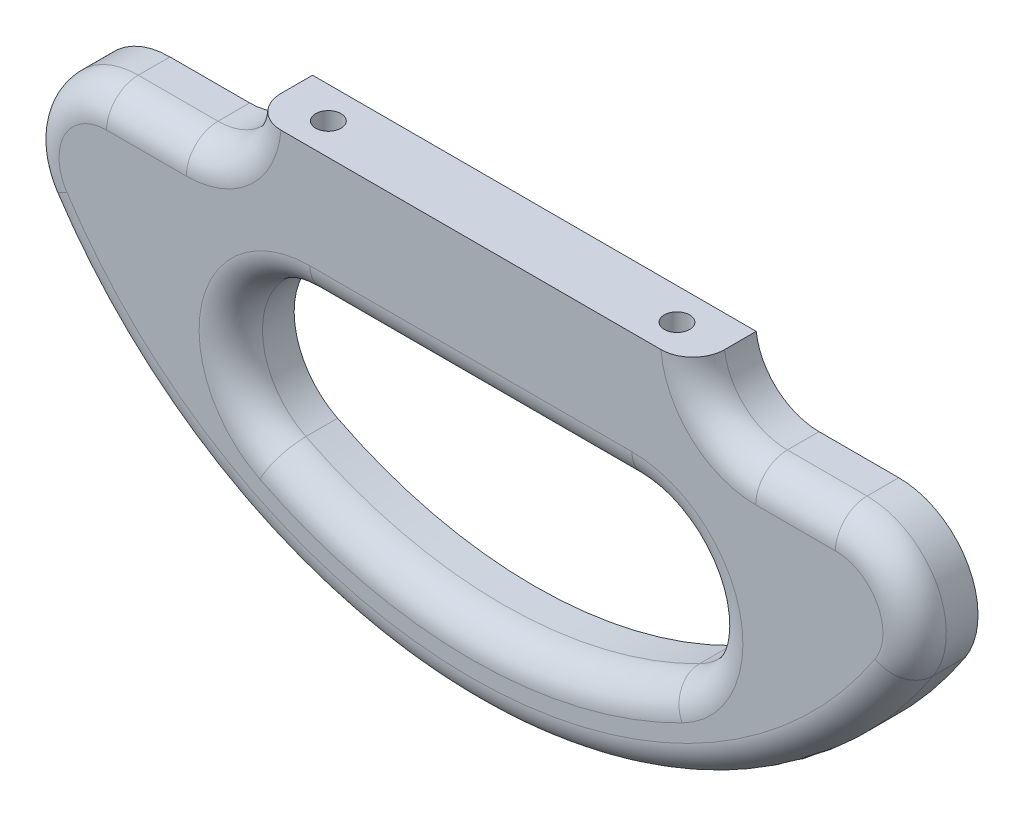
ISO-10303-21;
HEADER;
FILE_DESCRIPTION(('STEP AP214'),'2;1');
FILE_NAME('part.step','',(''),(''),'','','');
FILE_SCHEMA(('AUTOMOTIVE_DESIGN { 1 0 10303 214 1 1 1 1 }'));
ENDSEC;
DATA;
#1=APPLICATION_CONTEXT('core data for automotive mechanical design processes');
#2=APPLICATION_PROTOCOL_DEFINITION('international standard','automotive_design',2000,#1);
#3=PRODUCT_CONTEXT('',#1,'mechanical');
#4=PRODUCT('Part','Part','',(#3));
#5=PRODUCT_RELATED_PRODUCT_CATEGORY('part','',(#4));
#6=PRODUCT_DEFINITION_FORMATION('','',#4);
#7=PRODUCT_DEFINITION_CONTEXT('part definition',#1,'design');
#8=PRODUCT_DEFINITION('design','',#6,#7);
#9=PRODUCT_DEFINITION_SHAPE('','',#8);
#10=(LENGTH_UNIT() NAMED_UNIT(*) SI_UNIT(.MILLI.,.METRE.));
#11=(NAMED_UNIT(*) PLANE_ANGLE_UNIT() SI_UNIT($,.RADIAN.));
#12=(NAMED_UNIT(*) SI_UNIT($,.STERADIAN.) SOLID_ANGLE_UNIT());
#13=UNCERTAINTY_MEASURE_WITH_UNIT(LENGTH_MEASURE(1.E-05),#10,'distance_accuracy_value','');
#14=(GEOMETRIC_REPRESENTATION_CONTEXT(3) GLOBAL_UNCERTAINTY_ASSIGNED_CONTEXT((#13)) GLOBAL_UNIT_ASSIGNED_CONTEXT((#10,
#11,#12)) REPRESENTATION_CONTEXT('',''));
#15=CARTESIAN_POINT('',(0.,0.,0.));
#16=DIRECTION('',(0.,0.,1.));
#17=DIRECTION('',(1.,0.,0.));
#18=AXIS2_PLACEMENT_3D('',#15,#16,#17);
#19=CARTESIAN_POINT('',(46.,0.,8.));
#20=DIRECTION('',(0.,0.,-1.));
#21=DIRECTION('',(-1.,0.,0.));
#22=AXIS2_PLACEMENT_3D('',#19,#20,#21);
#23=CYLINDRICAL_SURFACE('',#22,10.);
#24=DIRECTION('',(0.,0.,-1.));
#25=VECTOR('',#24,1.);
#26=CARTESIAN_POINT('',(46.,10.,8.));
#27=LINE('',#26,#25);
#28=CARTESIAN_POINT('',(46.,10.,4.));
#29=VERTEX_POINT('',#28);
#30=CARTESIAN_POINT('',(46.,10.,0.));
#31=VERTEX_POINT('',#30);
#32=EDGE_CURVE('E253',#29,#31,#27,.T.);
#33=ORIENTED_EDGE('',*,*,#32,.F.);
#34=CARTESIAN_POINT('',(46.,0.,4.));
#35=DIRECTION('',(0.,0.,1.));
#36=DIRECTION('',(1.,0.,0.));
#37=AXIS2_PLACEMENT_3D('',#34,#35,#36);
#38=CIRCLE('',#37,10.);
#39=CARTESIAN_POINT('',(54.3636363636364,-5.4817503387932,4.));
#40=VERTEX_POINT('',#39);
#41=EDGE_CURVE('E441',#29,#40,#38,.F.);
#42=ORIENTED_EDGE('',*,*,#41,.T.);
#43=DIRECTION('',(0.,0.,1.));
#44=VECTOR('',#43,1.);
#45=CARTESIAN_POINT('',(54.3636363636364,-5.4817503387932,-112.623868872246));
#46=LINE('',#45,#44);
#47=CARTESIAN_POINT('',(54.3636363636364,-5.4817503387932,0.));
#48=VERTEX_POINT('',#47);
#49=EDGE_CURVE('E219',#48,#40,#46,.T.);
#50=ORIENTED_EDGE('',*,*,#49,.F.);
#51=CARTESIAN_POINT('',(46.,0.,0.));
#52=DIRECTION('',(0.,0.,1.));
#53=DIRECTION('',(1.,0.,0.));
#54=AXIS2_PLACEMENT_3D('',#51,#52,#53);
#55=CIRCLE('',#54,10.);
#56=EDGE_CURVE('E244',#48,#31,#55,.T.);
#57=ORIENTED_EDGE('',*,*,#56,.T.);
#58=EDGE_LOOP('',(#33,#42,#50,#57));
#59=FACE_BOUND('',#58,.T.);
#60=ADVANCED_FACE('F38',(#59),#23,.T.);
#61=CARTESIAN_POINT('',(-46.,10.,8.));
#62=DIRECTION('',(0.,-1.,0.));
#63=DIRECTION('',(0.,0.,-1.));
#64=AXIS2_PLACEMENT_3D('',#61,#62,#63);
#65=PLANE('',#64);
#66=DIRECTION('',(0.,0.,-1.));
#67=VECTOR('',#66,1.);
#68=CARTESIAN_POINT('',(-46.,10.,8.));
#69=LINE('',#68,#67);
#70=CARTESIAN_POINT('',(-46.,10.,4.));
#71=VERTEX_POINT('',#70);
#72=CARTESIAN_POINT('',(-46.,10.,0.));
#73=VERTEX_POINT('',#72);
#74=EDGE_CURVE('E251',#71,#73,#69,.T.);
#75=ORIENTED_EDGE('',*,*,#74,.F.);
#76=DIRECTION('',(-1.,0.,0.));
#77=VECTOR('',#76,1.);
#78=CARTESIAN_POINT('',(-35.9372539331938,10.,4.));
#79=LINE('',#78,#77);
#80=CARTESIAN_POINT('',(-35.9372539331938,10.,4.));
#81=VERTEX_POINT('',#80);
#82=EDGE_CURVE('E11',#71,#81,#79,.F.);
#83=ORIENTED_EDGE('',*,*,#82,.T.);
#84=DIRECTION('',(0.,0.,1.));
#85=VECTOR('',#84,1.);
#86=CARTESIAN_POINT('',(-35.9372539331938,10.,8.00000000000001));
#87=LINE('',#86,#85);
#88=CARTESIAN_POINT('',(-35.9372539331938,10.,0.));
#89=VERTEX_POINT('',#88);
#90=EDGE_CURVE('E260',#81,#89,#87,.F.);
#91=ORIENTED_EDGE('',*,*,#90,.T.);
#92=DIRECTION('',(-1.,0.,0.));
#93=VECTOR('',#92,1.);
#94=CARTESIAN_POINT('',(-46.,10.,0.));
#95=LINE('',#94,#93);
#96=EDGE_CURVE('E247',#89,#73,#95,.T.);
#97=ORIENTED_EDGE('',*,*,#96,.T.);
#98=EDGE_LOOP('',(#75,#83,#91,#97));
#99=FACE_BOUND('',#98,.T.);
#100=ADVANCED_FACE('F345',(#99),#65,.F.);
#101=DIRECTION('',(0.,0.,-1.));
#102=VECTOR('',#101,1.);
#103=CARTESIAN_POINT('',(35.9372539331938,10.,7.99999999999997));
#104=LINE('',#103,#102);
#105=CARTESIAN_POINT('',(35.9372539331938,10.,0.));
#106=VERTEX_POINT('',#105);
#107=CARTESIAN_POINT('',(35.9372539331938,10.,4.));
#108=VERTEX_POINT('',#107);
#109=EDGE_CURVE('E255',#106,#108,#104,.F.);
#110=ORIENTED_EDGE('',*,*,#109,.T.);
#111=DIRECTION('',(-1.,0.,0.));
#112=VECTOR('',#111,1.);
#113=CARTESIAN_POINT('',(46.,10.,4.));
#114=LINE('',#113,#112);
#115=EDGE_CURVE('E412',#108,#29,#114,.F.);
#116=ORIENTED_EDGE('',*,*,#115,.T.);
#117=ORIENTED_EDGE('',*,*,#32,.T.);
#118=EDGE_CURVE('E248',#31,#106,#95,.T.);
#119=ORIENTED_EDGE('',*,*,#118,.T.);
#120=EDGE_LOOP('',(#110,#116,#117,#119));
#121=FACE_BOUND('',#120,.T.);
#122=ADVANCED_FACE('F335',(#121),#65,.F.);
#123=CARTESIAN_POINT('',(-46.,0.,8.));
#124=DIRECTION('',(0.,0.,-1.));
#125=DIRECTION('',(-1.,0.,0.));
#126=AXIS2_PLACEMENT_3D('',#123,#124,#125);
#127=CYLINDRICAL_SURFACE('',#126,2.15);
#128=CARTESIAN_POINT('',(-46.,0.,0.));
#129=DIRECTION('',(0.,0.,1.));
#130=DIRECTION('',(1.,0.,0.));
#131=AXIS2_PLACEMENT_3D('',#128,#129,#130);
#132=CIRCLE('',#131,2.15);
#133=CARTESIAN_POINT('',(-43.85,0.,0.));
#134=VERTEX_POINT('',#133);
#135=EDGE_CURVE('E239',#134,#134,#132,.T.);
#136=ORIENTED_EDGE('',*,*,#135,.F.);
#137=EDGE_LOOP('',(#136));
#138=FACE_BOUND('',#137,.T.);
#139=CARTESIAN_POINT('',(-46.,0.,4.));
#140=DIRECTION('',(0.,0.,1.));
#141=DIRECTION('',(1.,0.,0.));
#142=AXIS2_PLACEMENT_3D('',#139,#140,#141);
#143=CIRCLE('',#142,2.15);
#144=CARTESIAN_POINT('',(-43.85,0.,4.));
#145=VERTEX_POINT('',#144);
#146=EDGE_CURVE('E233',#145,#145,#143,.T.);
#147=ORIENTED_EDGE('',*,*,#146,.T.);
#148=EDGE_LOOP('',(#147));
#149=FACE_BOUND('',#148,.T.);
#150=ADVANCED_FACE('F331',(#138,#149),#127,.F.);
#151=CARTESIAN_POINT('',(46.,0.,8.));
#152=DIRECTION('',(0.,0.,-1.));
#153=DIRECTION('',(-1.,0.,0.));
#154=AXIS2_PLACEMENT_3D('',#151,#152,#153);
#155=CYLINDRICAL_SURFACE('',#154,2.15);
#156=CARTESIAN_POINT('',(46.,0.,0.));
#157=DIRECTION('',(0.,0.,1.));
#158=DIRECTION('',(1.,0.,0.));
#159=AXIS2_PLACEMENT_3D('',#156,#157,#158);
#160=CIRCLE('',#159,2.15);
#161=CARTESIAN_POINT('',(48.15,0.,0.));
#162=VERTEX_POINT('',#161);
#163=EDGE_CURVE('E236',#162,#162,#160,.T.);
#164=ORIENTED_EDGE('',*,*,#163,.F.);
#165=EDGE_LOOP('',(#164));
#166=FACE_BOUND('',#165,.T.);
#167=CARTESIAN_POINT('',(46.,0.,4.));
#168=DIRECTION('',(0.,0.,1.));
#169=DIRECTION('',(1.,0.,0.));
#170=AXIS2_PLACEMENT_3D('',#167,#168,#169);
#171=CIRCLE('',#170,2.15);
#172=CARTESIAN_POINT('',(48.15,0.,4.));
#173=VERTEX_POINT('',#172);
#174=EDGE_CURVE('E232',#173,#173,#171,.T.);
#175=ORIENTED_EDGE('',*,*,#174,.T.);
#176=EDGE_LOOP('',(#175));
#177=FACE_BOUND('',#176,.T.);
#178=ADVANCED_FACE('F327',(#166,#177),#155,.F.);
#179=CARTESIAN_POINT('',(-46.,0.,8.));
#180=DIRECTION('',(0.,0.,1.));
#181=DIRECTION('',(1.,0.,0.));
#182=AXIS2_PLACEMENT_3D('',#179,#180,#181);
#183=PLANE('',#182);
#184=DIRECTION('',(1.,0.,0.));
#185=VECTOR('',#184,1.);
#186=CARTESIAN_POINT('',(20.322585040608,4.,8.));
#187=LINE('',#186,#185);
#188=CARTESIAN_POINT('',(-20.322585040608,4.,8.));
#189=VERTEX_POINT('',#188);
#190=CARTESIAN_POINT('',(20.322585040608,4.,8.));
#191=VERTEX_POINT('',#190);
#192=EDGE_CURVE('E285',#189,#191,#187,.T.);
#193=ORIENTED_EDGE('',*,*,#192,.T.);
#194=CARTESIAN_POINT('',(20.322585040608,-10.,8.));
#195=DIRECTION('',(0.,0.,1.));
#196=DIRECTION('',(1.,0.,0.));
#197=AXIS2_PLACEMENT_3D('',#194,#195,#196);
#198=CIRCLE('',#197,14.);
#199=CARTESIAN_POINT('',(26.6451670532417,-22.4909950241573,8.));
#200=VERTEX_POINT('',#199);
#201=EDGE_CURVE('E287',#191,#200,#198,.F.);
#202=ORIENTED_EDGE('',*,*,#201,.T.);
#203=CARTESIAN_POINT('',(0.,30.1496268633627,8.));
#204=DIRECTION('',(0.,0.,1.));
#205=DIRECTION('',(1.,0.,0.));
#206=AXIS2_PLACEMENT_3D('',#203,#204,#205);
#207=CIRCLE('',#206,59.);
#208=CARTESIAN_POINT('',(-26.6451670532417,-22.4909950241573,8.));
#209=VERTEX_POINT('',#208);
#210=EDGE_CURVE('E281',#200,#209,#207,.F.);
#211=ORIENTED_EDGE('',*,*,#210,.T.);
#212=CARTESIAN_POINT('',(-20.322585040608,-10.,8.));
#213=DIRECTION('',(0.,0.,1.));
#214=DIRECTION('',(1.,0.,0.));
#215=AXIS2_PLACEMENT_3D('',#212,#213,#214);
#216=CIRCLE('',#215,14.);
#217=EDGE_CURVE('E283',#209,#189,#216,.F.);
#218=ORIENTED_EDGE('',*,*,#217,.T.);
#219=EDGE_LOOP('',(#193,#202,#211,#218));
#220=FACE_BOUND('',#219,.T.);
#221=DIRECTION('',(1.,0.,0.));
#222=VECTOR('',#221,1.);
#223=CARTESIAN_POINT('',(-28.,17.,8.));
#224=LINE('',#223,#222);
#225=CARTESIAN_POINT('',(-23.9789931900924,17.,8.));
#226=VERTEX_POINT('',#225);
#227=CARTESIAN_POINT('',(23.9789931900924,17.,8.));
#228=VERTEX_POINT('',#227);
#229=EDGE_CURVE('E227',#226,#228,#224,.T.);
#230=ORIENTED_EDGE('',*,*,#229,.F.);
#231=CARTESIAN_POINT('',(-35.9372539331938,18.,8.));
#232=DIRECTION('',(0.,0.,1.));
#233=DIRECTION('',(1.,0.,0.));
#234=AXIS2_PLACEMENT_3D('',#231,#232,#233);
#235=CIRCLE('',#234,12.);
#236=CARTESIAN_POINT('',(-35.9372539331938,6.,8.));
#237=VERTEX_POINT('',#236);
#238=EDGE_CURVE('E278',#226,#237,#235,.F.);
#239=ORIENTED_EDGE('',*,*,#238,.T.);
#240=DIRECTION('',(-1.,0.,0.));
#241=VECTOR('',#240,1.);
#242=CARTESIAN_POINT('',(-46.,6.,8.));
#243=LINE('',#242,#241);
#244=CARTESIAN_POINT('',(-46.,6.,8.));
#245=VERTEX_POINT('',#244);
#246=EDGE_CURVE('E266',#237,#245,#243,.T.);
#247=ORIENTED_EDGE('',*,*,#246,.T.);
#248=CARTESIAN_POINT('',(-46.,0.,8.));
#249=DIRECTION('',(0.,0.,1.));
#250=DIRECTION('',(1.,0.,0.));
#251=AXIS2_PLACEMENT_3D('',#248,#249,#250);
#252=CIRCLE('',#251,6.);
#253=CARTESIAN_POINT('',(-51.0181818181818,-3.28905020327593,8.));
#254=VERTEX_POINT('',#253);
#255=EDGE_CURVE('E268',#245,#254,#252,.T.);
#256=ORIENTED_EDGE('',*,*,#255,.T.);
#257=CARTESIAN_POINT('',(0.,30.1496268633627,8.));
#258=DIRECTION('',(0.,0.,1.));
#259=DIRECTION('',(1.,0.,0.));
#260=AXIS2_PLACEMENT_3D('',#257,#258,#259);
#261=CIRCLE('',#260,61.);
#262=CARTESIAN_POINT('',(51.0181818181818,-3.28905020327592,8.));
#263=VERTEX_POINT('',#262);
#264=EDGE_CURVE('E270',#254,#263,#261,.T.);
#265=ORIENTED_EDGE('',*,*,#264,.T.);
#266=CARTESIAN_POINT('',(46.,0.,8.));
#267=DIRECTION('',(0.,0.,1.));
#268=DIRECTION('',(1.,0.,0.));
#269=AXIS2_PLACEMENT_3D('',#266,#267,#268);
#270=CIRCLE('',#269,6.);
#271=CARTESIAN_POINT('',(46.,6.,8.));
#272=VERTEX_POINT('',#271);
#273=EDGE_CURVE('E272',#263,#272,#270,.T.);
#274=ORIENTED_EDGE('',*,*,#273,.T.);
#275=DIRECTION('',(-1.,0.,0.));
#276=VECTOR('',#275,1.);
#277=CARTESIAN_POINT('',(35.9372539331938,6.,8.));
#278=LINE('',#277,#276);
#279=CARTESIAN_POINT('',(35.9372539331938,6.,8.));
#280=VERTEX_POINT('',#279);
#281=EDGE_CURVE('E274',#272,#280,#278,.T.);
#282=ORIENTED_EDGE('',*,*,#281,.T.);
#283=CARTESIAN_POINT('',(35.9372539331938,18.,8.));
#284=DIRECTION('',(0.,0.,1.));
#285=DIRECTION('',(1.,0.,0.));
#286=AXIS2_PLACEMENT_3D('',#283,#284,#285);
#287=CIRCLE('',#286,12.);
#288=EDGE_CURVE('E276',#280,#228,#287,.F.);
#289=ORIENTED_EDGE('',*,*,#288,.T.);
#290=EDGE_LOOP('',(#230,#239,#247,#256,#265,#274,#282,#289));
#291=FACE_BOUND('',#290,.T.);
#292=ADVANCED_FACE('F330',(#220,#291),#183,.T.);
#293=CARTESIAN_POINT('',(-46.,0.,0.));
#294=DIRECTION('',(0.,0.,1.));
#295=DIRECTION('',(1.,0.,0.));
#296=AXIS2_PLACEMENT_3D('',#293,#294,#295);
#297=PLANE('',#296);
#298=DIRECTION('',(1.,0.,0.));
#299=VECTOR('',#298,1.);
#300=CARTESIAN_POINT('',(20.322585040608,0.,0.));
#301=LINE('',#300,#299);
#302=CARTESIAN_POINT('',(-20.322585040608,0.,0.));
#303=VERTEX_POINT('',#302);
#304=CARTESIAN_POINT('',(20.322585040608,0.,0.));
#305=VERTEX_POINT('',#304);
#306=EDGE_CURVE('E196',#303,#305,#301,.T.);
#307=ORIENTED_EDGE('',*,*,#306,.F.);
#308=CARTESIAN_POINT('',(-20.322585040608,-10.,0.));
#309=DIRECTION('',(0.,0.,-1.));
#310=DIRECTION('',(1.,0.,0.));
#311=AXIS2_PLACEMENT_3D('',#308,#309,#310);
#312=CIRCLE('',#311,10.);
#313=CARTESIAN_POINT('',(-24.8387150496321,-18.9221393029695,0.));
#314=VERTEX_POINT('',#313);
#315=EDGE_CURVE('E193',#314,#303,#312,.T.);
#316=ORIENTED_EDGE('',*,*,#315,.F.);
#317=CARTESIAN_POINT('',(0.,30.1496268633627,0.));
#318=DIRECTION('',(0.,0.,-1.));
#319=DIRECTION('',(-1.,0.,0.));
#320=AXIS2_PLACEMENT_3D('',#317,#318,#319);
#321=CIRCLE('',#320,55.);
#322=CARTESIAN_POINT('',(24.8387150496321,-18.9221393029695,0.));
#323=VERTEX_POINT('',#322);
#324=EDGE_CURVE('E203',#323,#314,#321,.T.);
#325=ORIENTED_EDGE('',*,*,#324,.F.);
#326=CARTESIAN_POINT('',(20.322585040608,-10.,0.));
#327=DIRECTION('',(0.,0.,-1.));
#328=DIRECTION('',(-1.,0.,0.));
#329=AXIS2_PLACEMENT_3D('',#326,#327,#328);
#330=CIRCLE('',#329,10.);
#331=EDGE_CURVE('E200',#305,#323,#330,.T.);
#332=ORIENTED_EDGE('',*,*,#331,.F.);
#333=EDGE_LOOP('',(#307,#316,#325,#332));
#334=FACE_BOUND('',#333,.T.);
#335=CARTESIAN_POINT('',(-46.,0.,0.));
#336=DIRECTION('',(0.,0.,1.));
#337=DIRECTION('',(1.,0.,0.));
#338=AXIS2_PLACEMENT_3D('',#335,#336,#337);
#339=CIRCLE('',#338,10.);
#340=CARTESIAN_POINT('',(-54.3636363636364,-5.48175033879322,0.));
#341=VERTEX_POINT('',#340);
#342=EDGE_CURVE('E242',#73,#341,#339,.T.);
#343=ORIENTED_EDGE('',*,*,#342,.F.);
#344=ORIENTED_EDGE('',*,*,#96,.F.);
#345=CARTESIAN_POINT('',(-35.9372539331938,18.,0.));
#346=DIRECTION('',(0.,0.,1.));
#347=DIRECTION('',(1.,0.,0.));
#348=AXIS2_PLACEMENT_3D('',#345,#346,#347);
#349=CIRCLE('',#348,8.);
#350=CARTESIAN_POINT('',(-28.,17.,0.));
#351=VERTEX_POINT('',#350);
#352=EDGE_CURVE('E264',#89,#351,#349,.T.);
#353=ORIENTED_EDGE('',*,*,#352,.T.);
#354=DIRECTION('',(-1.,0.,0.));
#355=VECTOR('',#354,1.);
#356=CARTESIAN_POINT('',(28.,17.,0.));
#357=LINE('',#356,#355);
#358=CARTESIAN_POINT('',(28.,17.,0.));
#359=VERTEX_POINT('',#358);
#360=EDGE_CURVE('E218',#359,#351,#357,.T.);
#361=ORIENTED_EDGE('',*,*,#360,.F.);
#362=CARTESIAN_POINT('',(35.9372539331938,18.,0.));
#363=DIRECTION('',(0.,0.,1.));
#364=DIRECTION('',(1.,0.,0.));
#365=AXIS2_PLACEMENT_3D('',#362,#363,#364);
#366=CIRCLE('',#365,8.);
#367=EDGE_CURVE('E262',#359,#106,#366,.T.);
#368=ORIENTED_EDGE('',*,*,#367,.T.);
#369=ORIENTED_EDGE('',*,*,#118,.F.);
#370=ORIENTED_EDGE('',*,*,#56,.F.);
#371=CARTESIAN_POINT('',(0.,30.1496268633627,0.));
#372=DIRECTION('',(0.,0.,1.));
#373=DIRECTION('',(1.,0.,0.));
#374=AXIS2_PLACEMENT_3D('',#371,#372,#373);
#375=CIRCLE('',#374,65.);
#376=EDGE_CURVE('E215',#48,#341,#375,.F.);
#377=ORIENTED_EDGE('',*,*,#376,.T.);
#378=EDGE_LOOP('',(#343,#344,#353,#361,#368,#369,#370,#377));
#379=FACE_BOUND('',#378,.T.);
#380=ORIENTED_EDGE('',*,*,#135,.T.);
#381=EDGE_LOOP('',(#380));
#382=FACE_BOUND('',#381,.T.);
#383=ORIENTED_EDGE('',*,*,#163,.T.);
#384=EDGE_LOOP('',(#383));
#385=FACE_BOUND('',#384,.T.);
#386=ADVANCED_FACE('F339',(#334,#379,#382,#385),#297,.F.);
#387=CARTESIAN_POINT('',(-46.,0.,8.));
#388=DIRECTION('',(0.,0.,-1.));
#389=DIRECTION('',(-1.,0.,0.));
#390=AXIS2_PLACEMENT_3D('',#387,#388,#389);
#391=CYLINDRICAL_SURFACE('',#390,10.);
#392=DIRECTION('',(0.,0.,1.));
#393=VECTOR('',#392,1.);
#394=CARTESIAN_POINT('',(-54.3636363636364,-5.48175033879321,-112.623868872246));
#395=LINE('',#394,#393);
#396=CARTESIAN_POINT('',(-54.3636363636364,-5.48175033879321,4.));
#397=VERTEX_POINT('',#396);
#398=EDGE_CURVE('E209',#341,#397,#395,.T.);
#399=ORIENTED_EDGE('',*,*,#398,.T.);
#400=CARTESIAN_POINT('',(-46.,0.,4.));
#401=DIRECTION('',(0.,0.,1.));
#402=DIRECTION('',(1.,0.,0.));
#403=AXIS2_PLACEMENT_3D('',#400,#401,#402);
#404=CIRCLE('',#403,10.);
#405=EDGE_CURVE('E56',#397,#71,#404,.F.);
#406=ORIENTED_EDGE('',*,*,#405,.T.);
#407=ORIENTED_EDGE('',*,*,#74,.T.);
#408=ORIENTED_EDGE('',*,*,#342,.T.);
#409=EDGE_LOOP('',(#399,#406,#407,#408));
#410=FACE_BOUND('',#409,.T.);
#411=ADVANCED_FACE('F343',(#410),#391,.T.);
#412=CARTESIAN_POINT('',(-46.,0.,4.));
#413=DIRECTION('',(0.,0.,1.));
#414=DIRECTION('',(1.,0.,0.));
#415=AXIS2_PLACEMENT_3D('',#412,#413,#414);
#416=PLANE('',#415);
#417=ORIENTED_EDGE('',*,*,#174,.F.);
#418=EDGE_LOOP('',(#417));
#419=FACE_BOUND('',#418,.T.);
#420=ADVANCED_FACE('F325',(#419),#416,.F.);
#421=ORIENTED_EDGE('',*,*,#146,.F.);
#422=EDGE_LOOP('',(#421));
#423=FACE_BOUND('',#422,.T.);
#424=ADVANCED_FACE('F319',(#423),#416,.F.);
#425=CARTESIAN_POINT('',(0.,17.,0.));
#426=DIRECTION('',(0.,1.,0.));
#427=DIRECTION('',(0.,0.,1.));
#428=AXIS2_PLACEMENT_3D('',#425,#426,#427);
#429=PLANE('',#428);
#430=CARTESIAN_POINT('',(-22.,17.,3.99999999999999));
#431=DIRECTION('',(0.,1.,0.));
#432=DIRECTION('',(0.,0.,1.));
#433=AXIS2_PLACEMENT_3D('',#430,#431,#432);
#434=CIRCLE('',#433,1.6);
#435=CARTESIAN_POINT('',(-22.,17.,5.59999999999999));
#436=VERTEX_POINT('',#435);
#437=EDGE_CURVE('E182',#436,#436,#434,.T.);
#438=ORIENTED_EDGE('',*,*,#437,.F.);
#439=EDGE_LOOP('',(#438));
#440=FACE_BOUND('',#439,.T.);
#441=CARTESIAN_POINT('',(22.,17.,3.99999999999999));
#442=DIRECTION('',(0.,1.,0.));
#443=DIRECTION('',(0.,0.,1.));
#444=AXIS2_PLACEMENT_3D('',#441,#442,#443);
#445=CIRCLE('',#444,1.6);
#446=CARTESIAN_POINT('',(22.,17.,5.59999999999999));
#447=VERTEX_POINT('',#446);
#448=EDGE_CURVE('E181',#447,#447,#445,.T.);
#449=ORIENTED_EDGE('',*,*,#448,.F.);
#450=EDGE_LOOP('',(#449));
#451=FACE_BOUND('',#450,.T.);
#452=DIRECTION('',(0.,0.,1.));
#453=VECTOR('',#452,1.);
#454=CARTESIAN_POINT('',(-28.,17.,0.));
#455=LINE('',#454,#453);
#456=CARTESIAN_POINT('',(-28.,17.,4.));
#457=VERTEX_POINT('',#456);
#458=EDGE_CURVE('E224',#351,#457,#455,.T.);
#459=ORIENTED_EDGE('',*,*,#458,.T.);
#460=CARTESIAN_POINT('',(-28.,17.,4.));
#461=CARTESIAN_POINT('',(-28.0000116312915,17.,4.11195169383641));
#462=CARTESIAN_POINT('',(-27.9952629818568,17.,4.2238978420191));
#463=CARTESIAN_POINT('',(-27.9763349987582,17.,4.44698238703026));
#464=CARTESIAN_POINT('',(-27.9621563281608,17.,4.55812084009593));
#465=CARTESIAN_POINT('',(-27.9244774592254,17.,4.77869629851813));
#466=CARTESIAN_POINT('',(-27.9009868216442,17.,4.88813492972166));
#467=CARTESIAN_POINT('',(-27.8448856437188,17.,5.10461665354135));
#468=CARTESIAN_POINT('',(-27.812275172503,17.,5.21165976430895));
#469=CARTESIAN_POINT('',(-27.7010565130861,17.,5.52814264173975));
#470=CARTESIAN_POINT('',(-27.6090412918358,17.,5.73305100797173));
#471=CARTESIAN_POINT('',(-27.3921171918575,17.,6.12446791078556));
#472=CARTESIAN_POINT('',(-27.2672111711488,17.,6.31097804413219));
#473=CARTESIAN_POINT('',(-26.9874800678105,17.,6.6613689053573));
#474=CARTESIAN_POINT('',(-26.8325295258871,17.,6.82514961991453));
#475=CARTESIAN_POINT('',(-26.4974566288127,17.,7.12460008041573));
#476=CARTESIAN_POINT('',(-26.3173289900211,17.,7.26026391090275));
#477=CARTESIAN_POINT('',(-25.9357708711252,17.,7.50049841307874));
#478=CARTESIAN_POINT('',(-25.7342083672341,17.,7.60485922574797));
#479=CARTESIAN_POINT('',(-25.3164958320788,17.,7.77831780246858));
#480=CARTESIAN_POINT('',(-25.1003538572482,17.,7.84743486393214));
#481=CARTESIAN_POINT('',(-24.7323229629642,17.,7.93186129087176));
#482=CARTESIAN_POINT('',(-24.5826983483699,17.,7.95739295663305));
#483=CARTESIAN_POINT('',(-24.2817344695888,17.,7.9914612886712));
#484=CARTESIAN_POINT('',(-24.1303978265293,17.,8.00002112026732));
#485=CARTESIAN_POINT('',(-23.9789931900924,17.,8.));
#486=B_SPLINE_CURVE_WITH_KNOTS('',3,(#460,#461,#462,#463,#464,#465,#466,#467,#468,#469,#470,
#471,#472,#473,#474,#475,#476,#477,#478,#479,#480,#481,#482,#483,#484,#485),.UNSPECIFIED.,.F.,
.F.,(4,2,2,2,2,2,2,2,2,2,2,2,4),(0.,0.335744514854194,0.671465424524994,1.00684253282918,
1.3422170990396,2.0126204112975,2.68296548861656,3.3561725281459,4.02952105894929,
4.70728777607395,5.384682988307,5.83914450490994,6.29298528639702),.UNSPECIFIED.);
#487=EDGE_CURVE('E306',#457,#226,#486,.T.);
#488=ORIENTED_EDGE('',*,*,#487,.T.);
#489=ORIENTED_EDGE('',*,*,#229,.T.);
#490=CARTESIAN_POINT('',(23.9789931900924,17.,8.));
#491=CARTESIAN_POINT('',(24.0923992976859,17.,8.00001068246452));
#492=CARTESIAN_POINT('',(24.2057998211187,17.,7.99521067670684));
#493=CARTESIAN_POINT('',(24.4317879448955,17.,7.9760779540683));
#494=CARTESIAN_POINT('',(24.54437558883,17.,7.96174575224642));
#495=CARTESIAN_POINT('',(24.7678667146713,17.,7.92365124670236));
#496=CARTESIAN_POINT('',(24.8787713701839,17.,7.89989586050078));
#497=CARTESIAN_POINT('',(25.0981591910629,17.,7.84315008403206));
#498=CARTESIAN_POINT('',(25.2066423804903,17.,7.81015978557168));
#499=CARTESIAN_POINT('',(25.5274078370439,17.,7.69760740107733));
#500=CARTESIAN_POINT('',(25.7351035744388,17.,7.60444710079867));
#501=CARTESIAN_POINT('',(26.1317588862765,17.,7.38464038173687));
#502=CARTESIAN_POINT('',(26.3207215551576,17.,7.25799950618728));
#503=CARTESIAN_POINT('',(26.6746818538446,17.,6.97475498059511));
#504=CARTESIAN_POINT('',(26.8396821074403,17.,6.81815461535634));
#505=CARTESIAN_POINT('',(27.140954689526,17.,6.47934510111135));
#506=CARTESIAN_POINT('',(27.277221694549,17.,6.29713121704081));
#507=CARTESIAN_POINT('',(27.5165334328117,17.,5.91300487025535));
#508=CARTESIAN_POINT('',(27.6196983677347,17.,5.71116722821774));
#509=CARTESIAN_POINT('',(27.7903494858148,17.,5.29300085904572));
#510=CARTESIAN_POINT('',(27.8578604099247,17.,5.07668229823538));
#511=CARTESIAN_POINT('',(27.9375917864034,17.,4.71575452867821));
#512=CARTESIAN_POINT('',(27.9609790743685,17.,4.57351512049412));
#513=CARTESIAN_POINT('',(27.9921813172202,17.,4.28753831478249));
#514=CARTESIAN_POINT('',(28.0000177768971,17.,4.14380326261796));
#515=CARTESIAN_POINT('',(28.,17.,4.));
#516=B_SPLINE_CURVE_WITH_KNOTS('',3,(#490,#491,#492,#493,#494,#495,#496,#497,#498,#499,#500,
#501,#502,#503,#504,#505,#506,#507,#508,#509,#510,#511,#512,#513,#514,#515),.UNSPECIFIED.,.F.,
.F.,(4,2,2,2,2,2,2,2,2,2,2,2,4),(0.,0.340106863424487,0.680195351139451,1.02003464196008,
1.3598705544663,2.03924910285701,2.71851523985561,3.39770694372451,4.07702437246065,
4.75384635946748,5.43019806848969,5.86185921459297,6.29292301185335),.UNSPECIFIED.);
#517=CARTESIAN_POINT('',(28.,17.,4.));
#518=VERTEX_POINT('',#517);
#519=EDGE_CURVE('E299',#228,#518,#516,.T.);
#520=ORIENTED_EDGE('',*,*,#519,.T.);
#521=DIRECTION('',(0.,0.,-1.));
#522=VECTOR('',#521,1.);
#523=CARTESIAN_POINT('',(28.,17.,8.));
#524=LINE('',#523,#522);
#525=EDGE_CURVE('E230',#518,#359,#524,.T.);
#526=ORIENTED_EDGE('',*,*,#525,.T.);
#527=ORIENTED_EDGE('',*,*,#360,.T.);
#528=EDGE_LOOP('',(#459,#488,#489,#520,#526,#527));
#529=FACE_BOUND('',#528,.T.);
#530=ADVANCED_FACE('F313',(#440,#451,#529),#429,.T.);
#531=CARTESIAN_POINT('',(0.,30.1496268633627,-112.623868872246));
#532=DIRECTION('',(0.,0.,1.));
#533=DIRECTION('',(1.,0.,0.));
#534=AXIS2_PLACEMENT_3D('',#531,#532,#533);
#535=CYLINDRICAL_SURFACE('',#534,65.);
#536=ORIENTED_EDGE('',*,*,#49,.T.);
#537=CARTESIAN_POINT('',(0.,30.1496268633627,4.));
#538=DIRECTION('',(0.,0.,1.));
#539=DIRECTION('',(1.,0.,0.));
#540=AXIS2_PLACEMENT_3D('',#537,#538,#539);
#541=CIRCLE('',#540,65.);
#542=EDGE_CURVE('E64',#40,#397,#541,.F.);
#543=ORIENTED_EDGE('',*,*,#542,.T.);
#544=ORIENTED_EDGE('',*,*,#398,.F.);
#545=ORIENTED_EDGE('',*,*,#376,.F.);
#546=EDGE_LOOP('',(#536,#543,#544,#545));
#547=FACE_BOUND('',#546,.T.);
#548=ADVANCED_FACE('F318',(#547),#535,.T.);
#549=CARTESIAN_POINT('',(-20.322585040608,-10.,8.));
#550=DIRECTION('',(0.,0.,-1.));
#551=DIRECTION('',(-1.,0.,0.));
#552=AXIS2_PLACEMENT_3D('',#549,#550,#551);
#553=CYLINDRICAL_SURFACE('',#552,10.);
#554=DIRECTION('',(0.,0.,-1.));
#555=VECTOR('',#554,1.);
#556=CARTESIAN_POINT('',(-20.322585040608,0.,8.));
#557=LINE('',#556,#555);
#558=CARTESIAN_POINT('',(-20.322585040608,0.,4.));
#559=VERTEX_POINT('',#558);
#560=EDGE_CURVE('E206',#559,#303,#557,.T.);
#561=ORIENTED_EDGE('',*,*,#560,.F.);
#562=CARTESIAN_POINT('',(-20.322585040608,-10.,4.));
#563=DIRECTION('',(0.,0.,1.));
#564=DIRECTION('',(1.,0.,0.));
#565=AXIS2_PLACEMENT_3D('',#562,#563,#564);
#566=CIRCLE('',#565,10.);
#567=CARTESIAN_POINT('',(-24.8387150496321,-18.9221393029695,4.));
#568=VERTEX_POINT('',#567);
#569=EDGE_CURVE('E295',#559,#568,#566,.T.);
#570=ORIENTED_EDGE('',*,*,#569,.T.);
#571=DIRECTION('',(0.,0.,-1.));
#572=VECTOR('',#571,1.);
#573=CARTESIAN_POINT('',(-24.8387150496321,-18.9221393029695,8.));
#574=LINE('',#573,#572);
#575=EDGE_CURVE('E207',#568,#314,#574,.T.);
#576=ORIENTED_EDGE('',*,*,#575,.T.);
#577=ORIENTED_EDGE('',*,*,#315,.T.);
#578=EDGE_LOOP('',(#561,#570,#576,#577));
#579=FACE_BOUND('',#578,.T.);
#580=ADVANCED_FACE('F524',(#579),#553,.F.);
#581=CARTESIAN_POINT('',(0.,30.1496268633627,8.));
#582=DIRECTION('',(0.,0.,-1.));
#583=DIRECTION('',(-1.,0.,0.));
#584=AXIS2_PLACEMENT_3D('',#581,#582,#583);
#585=CYLINDRICAL_SURFACE('',#584,55.);
#586=ORIENTED_EDGE('',*,*,#575,.F.);
#587=CARTESIAN_POINT('',(0.,30.1496268633627,4.));
#588=DIRECTION('',(0.,0.,1.));
#589=DIRECTION('',(1.,0.,0.));
#590=AXIS2_PLACEMENT_3D('',#587,#588,#589);
#591=CIRCLE('',#590,55.);
#592=CARTESIAN_POINT('',(24.8387150496321,-18.9221393029695,4.));
#593=VERTEX_POINT('',#592);
#594=EDGE_CURVE('E48',#568,#593,#591,.T.);
#595=ORIENTED_EDGE('',*,*,#594,.T.);
#596=DIRECTION('',(0.,0.,-1.));
#597=VECTOR('',#596,1.);
#598=CARTESIAN_POINT('',(24.8387150496321,-18.9221393029695,8.));
#599=LINE('',#598,#597);
#600=EDGE_CURVE('E210',#593,#323,#599,.T.);
#601=ORIENTED_EDGE('',*,*,#600,.T.);
#602=ORIENTED_EDGE('',*,*,#324,.T.);
#603=EDGE_LOOP('',(#586,#595,#601,#602));
#604=FACE_BOUND('',#603,.T.);
#605=ADVANCED_FACE('F530',(#604),#585,.F.);
#606=CARTESIAN_POINT('',(20.322585040608,-10.,8.));
#607=DIRECTION('',(0.,0.,-1.));
#608=DIRECTION('',(-1.,0.,0.));
#609=AXIS2_PLACEMENT_3D('',#606,#607,#608);
#610=CYLINDRICAL_SURFACE('',#609,10.);
#611=ORIENTED_EDGE('',*,*,#600,.F.);
#612=CARTESIAN_POINT('',(20.322585040608,-10.,4.));
#613=DIRECTION('',(0.,0.,1.));
#614=DIRECTION('',(1.,0.,0.));
#615=AXIS2_PLACEMENT_3D('',#612,#613,#614);
#616=CIRCLE('',#615,10.);
#617=CARTESIAN_POINT('',(20.322585040608,0.,4.));
#618=VERTEX_POINT('',#617);
#619=EDGE_CURVE('E290',#593,#618,#616,.T.);
#620=ORIENTED_EDGE('',*,*,#619,.T.);
#621=DIRECTION('',(0.,0.,-1.));
#622=VECTOR('',#621,1.);
#623=CARTESIAN_POINT('',(20.322585040608,0.,8.));
#624=LINE('',#623,#622);
#625=EDGE_CURVE('E212',#618,#305,#624,.T.);
#626=ORIENTED_EDGE('',*,*,#625,.T.);
#627=ORIENTED_EDGE('',*,*,#331,.T.);
#628=EDGE_LOOP('',(#611,#620,#626,#627));
#629=FACE_BOUND('',#628,.T.);
#630=ADVANCED_FACE('F537',(#629),#610,.F.);
#631=CARTESIAN_POINT('',(20.322585040608,0.,8.));
#632=DIRECTION('',(0.,1.,0.));
#633=DIRECTION('',(0.,0.,1.));
#634=AXIS2_PLACEMENT_3D('',#631,#632,#633);
#635=PLANE('',#634);
#636=ORIENTED_EDGE('',*,*,#625,.F.);
#637=DIRECTION('',(1.,0.,0.));
#638=VECTOR('',#637,1.);
#639=CARTESIAN_POINT('',(-20.322585040608,0.,4.));
#640=LINE('',#639,#638);
#641=EDGE_CURVE('E293',#618,#559,#640,.F.);
#642=ORIENTED_EDGE('',*,*,#641,.T.);
#643=ORIENTED_EDGE('',*,*,#560,.T.);
#644=ORIENTED_EDGE('',*,*,#306,.T.);
#645=EDGE_LOOP('',(#636,#642,#643,#644));
#646=FACE_BOUND('',#645,.T.);
#647=ADVANCED_FACE('F358',(#646),#635,.F.);
#648=CARTESIAN_POINT('',(35.9372539331938,18.,8.));
#649=DIRECTION('',(0.,0.,-1.));
#650=DIRECTION('',(-1.,0.,0.));
#651=AXIS2_PLACEMENT_3D('',#648,#649,#650);
#652=CYLINDRICAL_SURFACE('',#651,8.);
#653=ORIENTED_EDGE('',*,*,#525,.F.);
#654=CARTESIAN_POINT('',(35.9372539331938,18.,4.));
#655=DIRECTION('',(0.,0.,1.));
#656=DIRECTION('',(1.,0.,0.));
#657=AXIS2_PLACEMENT_3D('',#654,#655,#656);
#658=CIRCLE('',#657,8.);
#659=EDGE_CURVE('E443',#518,#108,#658,.T.);
#660=ORIENTED_EDGE('',*,*,#659,.T.);
#661=ORIENTED_EDGE('',*,*,#109,.F.);
#662=ORIENTED_EDGE('',*,*,#367,.F.);
#663=EDGE_LOOP('',(#653,#660,#661,#662));
#664=FACE_BOUND('',#663,.T.);
#665=ADVANCED_FACE('F354',(#664),#652,.F.);
#666=CARTESIAN_POINT('',(-35.9372539331938,18.,0.));
#667=DIRECTION('',(0.,0.,1.));
#668=DIRECTION('',(1.,0.,0.));
#669=AXIS2_PLACEMENT_3D('',#666,#667,#668);
#670=CYLINDRICAL_SURFACE('',#669,8.);
#671=ORIENTED_EDGE('',*,*,#90,.F.);
#672=CARTESIAN_POINT('',(-35.9372539331938,18.,4.));
#673=DIRECTION('',(0.,0.,1.));
#674=DIRECTION('',(1.,0.,0.));
#675=AXIS2_PLACEMENT_3D('',#672,#673,#674);
#676=CIRCLE('',#675,8.);
#677=EDGE_CURVE('E297',#81,#457,#676,.T.);
#678=ORIENTED_EDGE('',*,*,#677,.T.);
#679=ORIENTED_EDGE('',*,*,#458,.F.);
#680=ORIENTED_EDGE('',*,*,#352,.F.);
#681=EDGE_LOOP('',(#671,#678,#679,#680));
#682=FACE_BOUND('',#681,.T.);
#683=ADVANCED_FACE('F357',(#682),#670,.F.);
#684=CARTESIAN_POINT('',(-20.322585040608,-10.,4.));
#685=DIRECTION('',(0.,0.,1.));
#686=DIRECTION('',(1.,0.,0.));
#687=AXIS2_PLACEMENT_3D('',#684,#685,#686);
#688=TOROIDAL_SURFACE('',#687,14.,4.);
#689=CARTESIAN_POINT('',(-26.6451670532417,-22.4909950241573,4.));
#690=DIRECTION('',(0.892213930296948,-0.451613000902401,0.));
#691=DIRECTION('',(0.451613000902402,0.892213930296948,0.));
#692=AXIS2_PLACEMENT_3D('',#689,#690,#691);
#693=CIRCLE('',#692,4.);
#694=EDGE_CURVE('E434',#568,#209,#693,.T.);
#695=ORIENTED_EDGE('',*,*,#694,.F.);
#696=ORIENTED_EDGE('',*,*,#569,.F.);
#697=CARTESIAN_POINT('',(-20.322585040608,4.,4.));
#698=DIRECTION('',(1.,0.,0.));
#699=DIRECTION('',(0.,0.,-1.));
#700=AXIS2_PLACEMENT_3D('',#697,#698,#699);
#701=CIRCLE('',#700,4.);
#702=EDGE_CURVE('E197',#189,#559,#701,.T.);
#703=ORIENTED_EDGE('',*,*,#702,.F.);
#704=ORIENTED_EDGE('',*,*,#217,.F.);
#705=EDGE_LOOP('',(#695,#696,#703,#704));
#706=FACE_BOUND('',#705,.T.);
#707=ADVANCED_FACE('F362',(#706),#688,.T.);
#708=CARTESIAN_POINT('',(-46.,4.,4.));
#709=DIRECTION('',(-1.,0.,0.));
#710=DIRECTION('',(0.,0.,1.));
#711=AXIS2_PLACEMENT_3D('',#708,#709,#710);
#712=CYLINDRICAL_SURFACE('',#711,4.);
#713=ORIENTED_EDGE('',*,*,#702,.T.);
#714=ORIENTED_EDGE('',*,*,#641,.F.);
#715=CARTESIAN_POINT('',(20.322585040608,4.,4.));
#716=DIRECTION('',(1.,0.,0.));
#717=DIRECTION('',(0.,0.,-1.));
#718=AXIS2_PLACEMENT_3D('',#715,#716,#717);
#719=CIRCLE('',#718,4.);
#720=EDGE_CURVE('E417',#191,#618,#719,.T.);
#721=ORIENTED_EDGE('',*,*,#720,.F.);
#722=ORIENTED_EDGE('',*,*,#192,.F.);
#723=EDGE_LOOP('',(#713,#714,#721,#722));
#724=FACE_BOUND('',#723,.T.);
#725=ADVANCED_FACE('F371',(#724),#712,.T.);
#726=CARTESIAN_POINT('',(0.,30.1496268633627,4.));
#727=DIRECTION('',(0.,0.,1.));
#728=DIRECTION('',(1.,0.,0.));
#729=AXIS2_PLACEMENT_3D('',#726,#727,#728);
#730=TOROIDAL_SURFACE('',#729,59.,4.);
#731=ORIENTED_EDGE('',*,*,#694,.T.);
#732=ORIENTED_EDGE('',*,*,#210,.F.);
#733=CARTESIAN_POINT('',(26.6451670532417,-22.4909950241573,4.));
#734=DIRECTION('',(0.892213930296948,0.451613000902401,0.));
#735=DIRECTION('',(-0.451613000902402,0.892213930296948,0.));
#736=AXIS2_PLACEMENT_3D('',#733,#734,#735);
#737=CIRCLE('',#736,4.);
#738=EDGE_CURVE('E415',#593,#200,#737,.T.);
#739=ORIENTED_EDGE('',*,*,#738,.F.);
#740=ORIENTED_EDGE('',*,*,#594,.F.);
#741=EDGE_LOOP('',(#731,#732,#739,#740));
#742=FACE_BOUND('',#741,.T.);
#743=ADVANCED_FACE('F367',(#742),#730,.T.);
#744=CARTESIAN_POINT('',(20.322585040608,-10.,4.));
#745=DIRECTION('',(0.,0.,1.));
#746=DIRECTION('',(1.,0.,0.));
#747=AXIS2_PLACEMENT_3D('',#744,#745,#746);
#748=TOROIDAL_SURFACE('',#747,14.,4.);
#749=ORIENTED_EDGE('',*,*,#720,.T.);
#750=ORIENTED_EDGE('',*,*,#619,.F.);
#751=ORIENTED_EDGE('',*,*,#738,.T.);
#752=ORIENTED_EDGE('',*,*,#201,.F.);
#753=EDGE_LOOP('',(#749,#750,#751,#752));
#754=FACE_BOUND('',#753,.T.);
#755=ADVANCED_FACE('F364',(#754),#748,.T.);
#756=CARTESIAN_POINT('',(35.9372539331938,18.,4.));
#757=DIRECTION('',(0.,0.,1.));
#758=DIRECTION('',(1.,0.,0.));
#759=AXIS2_PLACEMENT_3D('',#756,#757,#758);
#760=TOROIDAL_SURFACE('',#759,12.,4.);
#761=ORIENTED_EDGE('',*,*,#519,.F.);
#762=ORIENTED_EDGE('',*,*,#288,.F.);
#763=CARTESIAN_POINT('',(35.9372539331938,6.,4.));
#764=DIRECTION('',(1.,0.,0.));
#765=DIRECTION('',(0.,0.,-1.));
#766=AXIS2_PLACEMENT_3D('',#763,#764,#765);
#767=CIRCLE('',#766,4.);
#768=EDGE_CURVE('E43',#108,#280,#767,.T.);
#769=ORIENTED_EDGE('',*,*,#768,.F.);
#770=ORIENTED_EDGE('',*,*,#659,.F.);
#771=EDGE_LOOP('',(#761,#762,#769,#770));
#772=FACE_BOUND('',#771,.T.);
#773=ADVANCED_FACE('F40',(#772),#760,.T.);
#774=CARTESIAN_POINT('',(-46.,6.,4.));
#775=DIRECTION('',(1.,0.,0.));
#776=DIRECTION('',(0.,0.,-1.));
#777=AXIS2_PLACEMENT_3D('',#774,#775,#776);
#778=CYLINDRICAL_SURFACE('',#777,4.);
#779=ORIENTED_EDGE('',*,*,#768,.T.);
#780=ORIENTED_EDGE('',*,*,#281,.F.);
#781=CARTESIAN_POINT('',(46.,6.,4.));
#782=DIRECTION('',(1.,0.,0.));
#783=DIRECTION('',(0.,0.,-1.));
#784=AXIS2_PLACEMENT_3D('',#781,#782,#783);
#785=CIRCLE('',#784,4.);
#786=EDGE_CURVE('E416',#29,#272,#785,.T.);
#787=ORIENTED_EDGE('',*,*,#786,.F.);
#788=ORIENTED_EDGE('',*,*,#115,.F.);
#789=EDGE_LOOP('',(#779,#780,#787,#788));
#790=FACE_BOUND('',#789,.T.);
#791=ADVANCED_FACE('F398',(#790),#778,.T.);
#792=CARTESIAN_POINT('',(46.,0.,4.));
#793=DIRECTION('',(0.,0.,1.));
#794=DIRECTION('',(1.,0.,0.));
#795=AXIS2_PLACEMENT_3D('',#792,#793,#794);
#796=TOROIDAL_SURFACE('',#795,6.,4.);
#797=ORIENTED_EDGE('',*,*,#786,.T.);
#798=ORIENTED_EDGE('',*,*,#273,.F.);
#799=CARTESIAN_POINT('',(51.0181818181818,-3.28905020327592,4.));
#800=DIRECTION('',(-0.54817503387932,-0.836363636363637,0.));
#801=DIRECTION('',(0.836363636363637,-0.54817503387932,0.));
#802=AXIS2_PLACEMENT_3D('',#799,#800,#801);
#803=CIRCLE('',#802,4.);
#804=EDGE_CURVE('E419',#40,#263,#803,.T.);
#805=ORIENTED_EDGE('',*,*,#804,.F.);
#806=ORIENTED_EDGE('',*,*,#41,.F.);
#807=EDGE_LOOP('',(#797,#798,#805,#806));
#808=FACE_BOUND('',#807,.T.);
#809=ADVANCED_FACE('F395',(#808),#796,.T.);
#810=CARTESIAN_POINT('',(0.,30.1496268633627,4.));
#811=DIRECTION('',(0.,0.,1.));
#812=DIRECTION('',(1.,0.,0.));
#813=AXIS2_PLACEMENT_3D('',#810,#811,#812);
#814=TOROIDAL_SURFACE('',#813,61.,4.);
#815=ORIENTED_EDGE('',*,*,#804,.T.);
#816=ORIENTED_EDGE('',*,*,#264,.F.);
#817=CARTESIAN_POINT('',(-51.0181818181818,-3.28905020327593,4.));
#818=DIRECTION('',(-0.548175033879321,0.836363636363636,0.));
#819=DIRECTION('',(-0.836363636363636,-0.548175033879321,0.));
#820=AXIS2_PLACEMENT_3D('',#817,#818,#819);
#821=CIRCLE('',#820,4.);
#822=EDGE_CURVE('E423',#397,#254,#821,.T.);
#823=ORIENTED_EDGE('',*,*,#822,.F.);
#824=ORIENTED_EDGE('',*,*,#542,.F.);
#825=EDGE_LOOP('',(#815,#816,#823,#824));
#826=FACE_BOUND('',#825,.T.);
#827=ADVANCED_FACE('F391',(#826),#814,.T.);
#828=CARTESIAN_POINT('',(-46.,0.,4.));
#829=DIRECTION('',(0.,0.,1.));
#830=DIRECTION('',(1.,0.,0.));
#831=AXIS2_PLACEMENT_3D('',#828,#829,#830);
#832=TOROIDAL_SURFACE('',#831,6.,4.);
#833=ORIENTED_EDGE('',*,*,#822,.T.);
#834=ORIENTED_EDGE('',*,*,#255,.F.);
#835=CARTESIAN_POINT('',(-46.,6.,4.));
#836=DIRECTION('',(1.,0.,0.));
#837=DIRECTION('',(0.,0.,-1.));
#838=AXIS2_PLACEMENT_3D('',#835,#836,#837);
#839=CIRCLE('',#838,4.);
#840=EDGE_CURVE('E428',#71,#245,#839,.T.);
#841=ORIENTED_EDGE('',*,*,#840,.F.);
#842=ORIENTED_EDGE('',*,*,#405,.F.);
#843=EDGE_LOOP('',(#833,#834,#841,#842));
#844=FACE_BOUND('',#843,.T.);
#845=ADVANCED_FACE('F387',(#844),#832,.T.);
#846=CARTESIAN_POINT('',(-46.,6.,4.));
#847=DIRECTION('',(1.,0.,0.));
#848=DIRECTION('',(0.,0.,-1.));
#849=AXIS2_PLACEMENT_3D('',#846,#847,#848);
#850=CYLINDRICAL_SURFACE('',#849,4.);
#851=ORIENTED_EDGE('',*,*,#840,.T.);
#852=ORIENTED_EDGE('',*,*,#246,.F.);
#853=CARTESIAN_POINT('',(-35.9372539331938,6.,4.));
#854=DIRECTION('',(1.,0.,0.));
#855=DIRECTION('',(0.,0.,-1.));
#856=AXIS2_PLACEMENT_3D('',#853,#854,#855);
#857=CIRCLE('',#856,4.);
#858=EDGE_CURVE('E192',#81,#237,#857,.T.);
#859=ORIENTED_EDGE('',*,*,#858,.F.);
#860=ORIENTED_EDGE('',*,*,#82,.F.);
#861=EDGE_LOOP('',(#851,#852,#859,#860));
#862=FACE_BOUND('',#861,.T.);
#863=ADVANCED_FACE('F383',(#862),#850,.T.);
#864=CARTESIAN_POINT('',(-35.9372539331938,18.,4.));
#865=DIRECTION('',(0.,0.,1.));
#866=DIRECTION('',(1.,0.,0.));
#867=AXIS2_PLACEMENT_3D('',#864,#865,#866);
#868=TOROIDAL_SURFACE('',#867,12.,4.);
#869=ORIENTED_EDGE('',*,*,#487,.F.);
#870=ORIENTED_EDGE('',*,*,#677,.F.);
#871=ORIENTED_EDGE('',*,*,#858,.T.);
#872=ORIENTED_EDGE('',*,*,#238,.F.);
#873=EDGE_LOOP('',(#869,#870,#871,#872));
#874=FACE_BOUND('',#873,.T.);
#875=ADVANCED_FACE('F378',(#874),#868,.T.);
#876=CARTESIAN_POINT('',(22.,9.,3.99999999999999));
#877=DIRECTION('',(0.,1.,0.));
#878=DIRECTION('',(0.,0.,1.));
#879=AXIS2_PLACEMENT_3D('',#876,#877,#878);
#880=CONICAL_SURFACE('',#879,1.6,1.02974425867665);
#881=CARTESIAN_POINT('',(22.,8.0386230095559,3.99999999999999));
#882=VERTEX_POINT('',#881);
#883=VERTEX_LOOP('',#882);
#884=FACE_BOUND('',#883,.T.);
#885=CARTESIAN_POINT('',(22.,9.,3.99999999999999));
#886=DIRECTION('',(0.,1.,0.));
#887=DIRECTION('',(0.,0.,1.));
#888=AXIS2_PLACEMENT_3D('',#885,#886,#887);
#889=CIRCLE('',#888,1.6);
#890=CARTESIAN_POINT('',(22.,9.,5.59999999999999));
#891=VERTEX_POINT('',#890);
#892=EDGE_CURVE('E185',#891,#891,#889,.T.);
#893=ORIENTED_EDGE('',*,*,#892,.T.);
#894=EDGE_LOOP('',(#893));
#895=FACE_BOUND('',#894,.T.);
#896=ADVANCED_FACE('F382',(#884,#895),#880,.F.);
#897=CARTESIAN_POINT('',(22.,17.,3.99999999999999));
#898=DIRECTION('',(0.,1.,0.));
#899=DIRECTION('',(0.,0.,1.));
#900=AXIS2_PLACEMENT_3D('',#897,#898,#899);
#901=CYLINDRICAL_SURFACE('',#900,1.6);
#902=ORIENTED_EDGE('',*,*,#892,.F.);
#903=EDGE_LOOP('',(#902));
#904=FACE_BOUND('',#903,.T.);
#905=ORIENTED_EDGE('',*,*,#448,.T.);
#906=EDGE_LOOP('',(#905));
#907=FACE_BOUND('',#906,.T.);
#908=ADVANCED_FACE('F175',(#904,#907),#901,.F.);
#909=CARTESIAN_POINT('',(-22.,9.,3.99999999999999));
#910=DIRECTION('',(0.,1.,0.));
#911=DIRECTION('',(0.,0.,1.));
#912=AXIS2_PLACEMENT_3D('',#909,#910,#911);
#913=CONICAL_SURFACE('',#912,1.6,1.02974425867665);
#914=CARTESIAN_POINT('',(-22.,8.0386230095559,3.99999999999999));
#915=VERTEX_POINT('',#914);
#916=VERTEX_LOOP('',#915);
#917=FACE_BOUND('',#916,.T.);
#918=CARTESIAN_POINT('',(-22.,9.,3.99999999999999));
#919=DIRECTION('',(0.,1.,0.));
#920=DIRECTION('',(0.,0.,1.));
#921=AXIS2_PLACEMENT_3D('',#918,#919,#920);
#922=CIRCLE('',#921,1.6);
#923=CARTESIAN_POINT('',(-22.,9.,5.59999999999999));
#924=VERTEX_POINT('',#923);
#925=EDGE_CURVE('E179',#924,#924,#922,.T.);
#926=ORIENTED_EDGE('',*,*,#925,.T.);
#927=EDGE_LOOP('',(#926));
#928=FACE_BOUND('',#927,.T.);
#929=ADVANCED_FACE('F171',(#917,#928),#913,.F.);
#930=CARTESIAN_POINT('',(-22.,17.,3.99999999999999));
#931=DIRECTION('',(0.,1.,0.));
#932=DIRECTION('',(0.,0.,1.));
#933=AXIS2_PLACEMENT_3D('',#930,#931,#932);
#934=CYLINDRICAL_SURFACE('',#933,1.6);
#935=ORIENTED_EDGE('',*,*,#925,.F.);
#936=EDGE_LOOP('',(#935));
#937=FACE_BOUND('',#936,.T.);
#938=ORIENTED_EDGE('',*,*,#437,.T.);
#939=EDGE_LOOP('',(#938));
#940=FACE_BOUND('',#939,.T.);
#941=ADVANCED_FACE('F174',(#937,#940),#934,.F.);
#942=CLOSED_SHELL('',(#60,#100,#122,#150,#178,#292,#386,#411,#420,#424,#530,#548,#580,#605,#630,
#647,#665,#683,#707,#725,#743,#755,#773,#791,#809,#827,#845,#863,#875,#896,#908,#929,#941));
#943=MANIFOLD_SOLID_BREP('B2',#942);
#944=ADVANCED_BREP_SHAPE_REPRESENTATION('',(#18,#943),#14);
#945=SHAPE_DEFINITION_REPRESENTATION(#9,#944);
ENDSEC;
END-ISO-10303-21;
